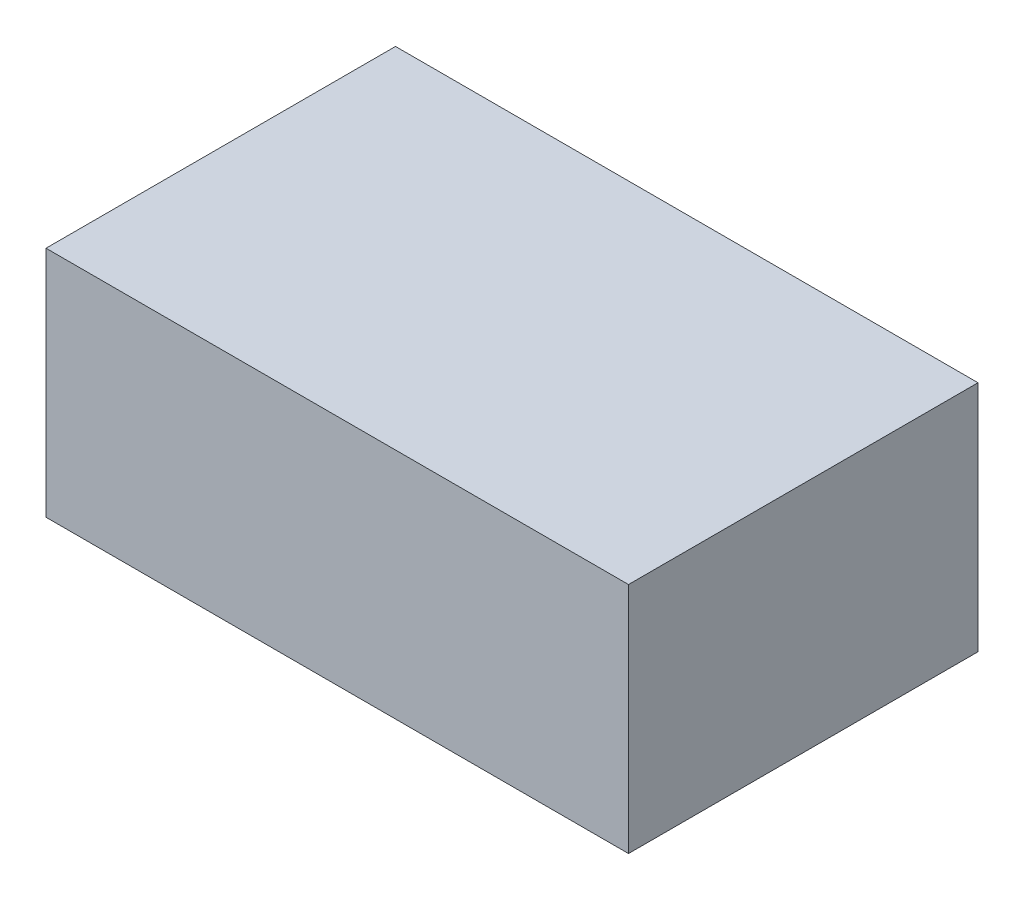
ISO-10303-21;
HEADER;
FILE_DESCRIPTION(('STEP AP214'),'2;1');
FILE_NAME('part.step','',(''),(''),'','','');
FILE_SCHEMA(('AUTOMOTIVE_DESIGN { 1 0 10303 214 1 1 1 1 }'));
ENDSEC;
DATA;
#1=APPLICATION_CONTEXT('core data for automotive mechanical design processes');
#2=APPLICATION_PROTOCOL_DEFINITION('international standard','automotive_design',2000,#1);
#3=PRODUCT_CONTEXT('',#1,'mechanical');
#4=PRODUCT('Part','Part','',(#3));
#5=PRODUCT_RELATED_PRODUCT_CATEGORY('part','',(#4));
#6=PRODUCT_DEFINITION_FORMATION('','',#4);
#7=PRODUCT_DEFINITION_CONTEXT('part definition',#1,'design');
#8=PRODUCT_DEFINITION('design','',#6,#7);
#9=PRODUCT_DEFINITION_SHAPE('','',#8);
#10=(LENGTH_UNIT() NAMED_UNIT(*) SI_UNIT(.MILLI.,.METRE.));
#11=(NAMED_UNIT(*) PLANE_ANGLE_UNIT() SI_UNIT($,.RADIAN.));
#12=(NAMED_UNIT(*) SI_UNIT($,.STERADIAN.) SOLID_ANGLE_UNIT());
#13=UNCERTAINTY_MEASURE_WITH_UNIT(LENGTH_MEASURE(1.E-05),#10,'distance_accuracy_value','');
#14=(GEOMETRIC_REPRESENTATION_CONTEXT(3) GLOBAL_UNCERTAINTY_ASSIGNED_CONTEXT((#13)) GLOBAL_UNIT_ASSIGNED_CONTEXT((#10,
#11,#12)) REPRESENTATION_CONTEXT('',''));
#15=CARTESIAN_POINT('',(0.,0.,0.));
#16=DIRECTION('',(0.,0.,1.));
#17=DIRECTION('',(1.,0.,0.));
#18=AXIS2_PLACEMENT_3D('',#15,#16,#17);
#19=CARTESIAN_POINT('',(-30.7135610311844,22.,-51.4569249679017));
#20=DIRECTION('',(1.,0.,0.));
#21=DIRECTION('',(0.,0.,-1.));
#22=AXIS2_PLACEMENT_3D('',#19,#20,#21);
#23=PLANE('',#22);
#24=DIRECTION('',(0.,0.,1.));
#25=VECTOR('',#24,1.);
#26=CARTESIAN_POINT('',(-30.7135610311844,20.,-51.4569249679017));
#27=LINE('',#26,#25);
#28=CARTESIAN_POINT('',(-30.7135610311844,20.,-51.4569249679017));
#29=VERTEX_POINT('',#28);
#30=CARTESIAN_POINT('',(-30.7135610311844,20.,-48.4569249679017));
#31=VERTEX_POINT('',#30);
#32=EDGE_CURVE('E102',#29,#31,#27,.T.);
#33=ORIENTED_EDGE('',*,*,#32,.T.);
#34=DIRECTION('',(0.,-1.,0.));
#35=VECTOR('',#34,1.);
#36=CARTESIAN_POINT('',(-30.7135610311844,22.,-48.4569249679017));
#37=LINE('',#36,#35);
#38=CARTESIAN_POINT('',(-30.7135610311844,22.,-48.4569249679017));
#39=VERTEX_POINT('',#38);
#40=EDGE_CURVE('E11',#39,#31,#37,.T.);
#41=ORIENTED_EDGE('',*,*,#40,.F.);
#42=DIRECTION('',(0.,0.,1.));
#43=VECTOR('',#42,1.);
#44=CARTESIAN_POINT('',(-30.7135610311844,22.,-51.4569249679017));
#45=LINE('',#44,#43);
#46=CARTESIAN_POINT('',(-30.7135610311844,22.,-51.4569249679017));
#47=VERTEX_POINT('',#46);
#48=EDGE_CURVE('E90',#47,#39,#45,.T.);
#49=ORIENTED_EDGE('',*,*,#48,.F.);
#50=DIRECTION('',(0.,-1.,0.));
#51=VECTOR('',#50,1.);
#52=CARTESIAN_POINT('',(-30.7135610311844,22.,-51.4569249679017));
#53=LINE('',#52,#51);
#54=EDGE_CURVE('E98',#47,#29,#53,.T.);
#55=ORIENTED_EDGE('',*,*,#54,.T.);
#56=EDGE_LOOP('',(#33,#41,#49,#55));
#57=FACE_BOUND('',#56,.T.);
#58=ADVANCED_FACE('F39',(#57),#23,.F.);
#59=CARTESIAN_POINT('',(-30.7135610311844,22.,-48.4569249679017));
#60=DIRECTION('',(0.,0.,-1.));
#61=DIRECTION('',(-1.,0.,0.));
#62=AXIS2_PLACEMENT_3D('',#59,#60,#61);
#63=PLANE('',#62);
#64=DIRECTION('',(1.,0.,0.));
#65=VECTOR('',#64,1.);
#66=CARTESIAN_POINT('',(-30.7135610311844,20.,-48.4569249679017));
#67=LINE('',#66,#65);
#68=CARTESIAN_POINT('',(-25.7135610311844,20.,-48.4569249679017));
#69=VERTEX_POINT('',#68);
#70=EDGE_CURVE('E94',#31,#69,#67,.T.);
#71=ORIENTED_EDGE('',*,*,#70,.T.);
#72=DIRECTION('',(0.,-1.,0.));
#73=VECTOR('',#72,1.);
#74=CARTESIAN_POINT('',(-25.7135610311844,22.,-48.4569249679017));
#75=LINE('',#74,#73);
#76=CARTESIAN_POINT('',(-25.7135610311844,22.,-48.4569249679017));
#77=VERTEX_POINT('',#76);
#78=EDGE_CURVE('E47',#77,#69,#75,.T.);
#79=ORIENTED_EDGE('',*,*,#78,.F.);
#80=DIRECTION('',(1.,0.,0.));
#81=VECTOR('',#80,1.);
#82=CARTESIAN_POINT('',(-30.7135610311844,22.,-48.4569249679017));
#83=LINE('',#82,#81);
#84=EDGE_CURVE('E85',#39,#77,#83,.T.);
#85=ORIENTED_EDGE('',*,*,#84,.F.);
#86=ORIENTED_EDGE('',*,*,#40,.T.);
#87=EDGE_LOOP('',(#71,#79,#85,#86));
#88=FACE_BOUND('',#87,.T.);
#89=ADVANCED_FACE('F93',(#88),#63,.F.);
#90=CARTESIAN_POINT('',(-25.7135610311844,22.,-51.4569249679017));
#91=DIRECTION('',(-1.,0.,0.));
#92=DIRECTION('',(0.,0.,1.));
#93=AXIS2_PLACEMENT_3D('',#90,#91,#92);
#94=PLANE('',#93);
#95=DIRECTION('',(0.,0.,-1.));
#96=VECTOR('',#95,1.);
#97=CARTESIAN_POINT('',(-25.7135610311844,20.,-51.4569249679017));
#98=LINE('',#97,#96);
#99=CARTESIAN_POINT('',(-25.7135610311844,20.,-51.4569249679017));
#100=VERTEX_POINT('',#99);
#101=EDGE_CURVE('E72',#69,#100,#98,.T.);
#102=ORIENTED_EDGE('',*,*,#101,.T.);
#103=DIRECTION('',(0.,-1.,0.));
#104=VECTOR('',#103,1.);
#105=CARTESIAN_POINT('',(-25.7135610311844,22.,-51.4569249679017));
#106=LINE('',#105,#104);
#107=CARTESIAN_POINT('',(-25.7135610311844,22.,-51.4569249679017));
#108=VERTEX_POINT('',#107);
#109=EDGE_CURVE('E95',#108,#100,#106,.T.);
#110=ORIENTED_EDGE('',*,*,#109,.F.);
#111=DIRECTION('',(0.,0.,-1.));
#112=VECTOR('',#111,1.);
#113=CARTESIAN_POINT('',(-25.7135610311844,22.,-51.4569249679017));
#114=LINE('',#113,#112);
#115=EDGE_CURVE('E88',#77,#108,#114,.T.);
#116=ORIENTED_EDGE('',*,*,#115,.F.);
#117=ORIENTED_EDGE('',*,*,#78,.T.);
#118=EDGE_LOOP('',(#102,#110,#116,#117));
#119=FACE_BOUND('',#118,.T.);
#120=ADVANCED_FACE('F96',(#119),#94,.F.);
#121=CARTESIAN_POINT('',(-30.7135610311844,22.,-51.4569249679017));
#122=DIRECTION('',(0.,0.,1.));
#123=DIRECTION('',(1.,0.,0.));
#124=AXIS2_PLACEMENT_3D('',#121,#122,#123);
#125=PLANE('',#124);
#126=DIRECTION('',(-1.,0.,0.));
#127=VECTOR('',#126,1.);
#128=CARTESIAN_POINT('',(-30.7135610311844,20.,-51.4569249679017));
#129=LINE('',#128,#127);
#130=EDGE_CURVE('E78',#100,#29,#129,.T.);
#131=ORIENTED_EDGE('',*,*,#130,.T.);
#132=ORIENTED_EDGE('',*,*,#54,.F.);
#133=DIRECTION('',(-1.,0.,0.));
#134=VECTOR('',#133,1.);
#135=CARTESIAN_POINT('',(-30.7135610311844,22.,-51.4569249679017));
#136=LINE('',#135,#134);
#137=EDGE_CURVE('E55',#108,#47,#136,.T.);
#138=ORIENTED_EDGE('',*,*,#137,.F.);
#139=ORIENTED_EDGE('',*,*,#109,.T.);
#140=EDGE_LOOP('',(#131,#132,#138,#139));
#141=FACE_BOUND('',#140,.T.);
#142=ADVANCED_FACE('F109',(#141),#125,.F.);
#143=CARTESIAN_POINT('',(0.,22.,0.));
#144=DIRECTION('',(0.,1.,0.));
#145=DIRECTION('',(0.,0.,1.));
#146=AXIS2_PLACEMENT_3D('',#143,#144,#145);
#147=PLANE('',#146);
#148=ORIENTED_EDGE('',*,*,#48,.T.);
#149=ORIENTED_EDGE('',*,*,#84,.T.);
#150=ORIENTED_EDGE('',*,*,#115,.T.);
#151=ORIENTED_EDGE('',*,*,#137,.T.);
#152=EDGE_LOOP('',(#148,#149,#150,#151));
#153=FACE_BOUND('',#152,.T.);
#154=ADVANCED_FACE('F86',(#153),#147,.T.);
#155=CARTESIAN_POINT('',(0.,20.,0.));
#156=DIRECTION('',(0.,1.,0.));
#157=DIRECTION('',(0.,0.,1.));
#158=AXIS2_PLACEMENT_3D('',#155,#156,#157);
#159=PLANE('',#158);
#160=ORIENTED_EDGE('',*,*,#32,.F.);
#161=ORIENTED_EDGE('',*,*,#130,.F.);
#162=ORIENTED_EDGE('',*,*,#101,.F.);
#163=ORIENTED_EDGE('',*,*,#70,.F.);
#164=EDGE_LOOP('',(#160,#161,#162,#163));
#165=FACE_BOUND('',#164,.T.);
#166=ADVANCED_FACE('F112',(#165),#159,.F.);
#167=CLOSED_SHELL('',(#58,#89,#120,#142,#154,#166));
#168=MANIFOLD_SOLID_BREP('B2',#167);
#169=ADVANCED_BREP_SHAPE_REPRESENTATION('',(#18,#168),#14);
#170=SHAPE_DEFINITION_REPRESENTATION(#9,#169);
ENDSEC;
END-ISO-10303-21;
